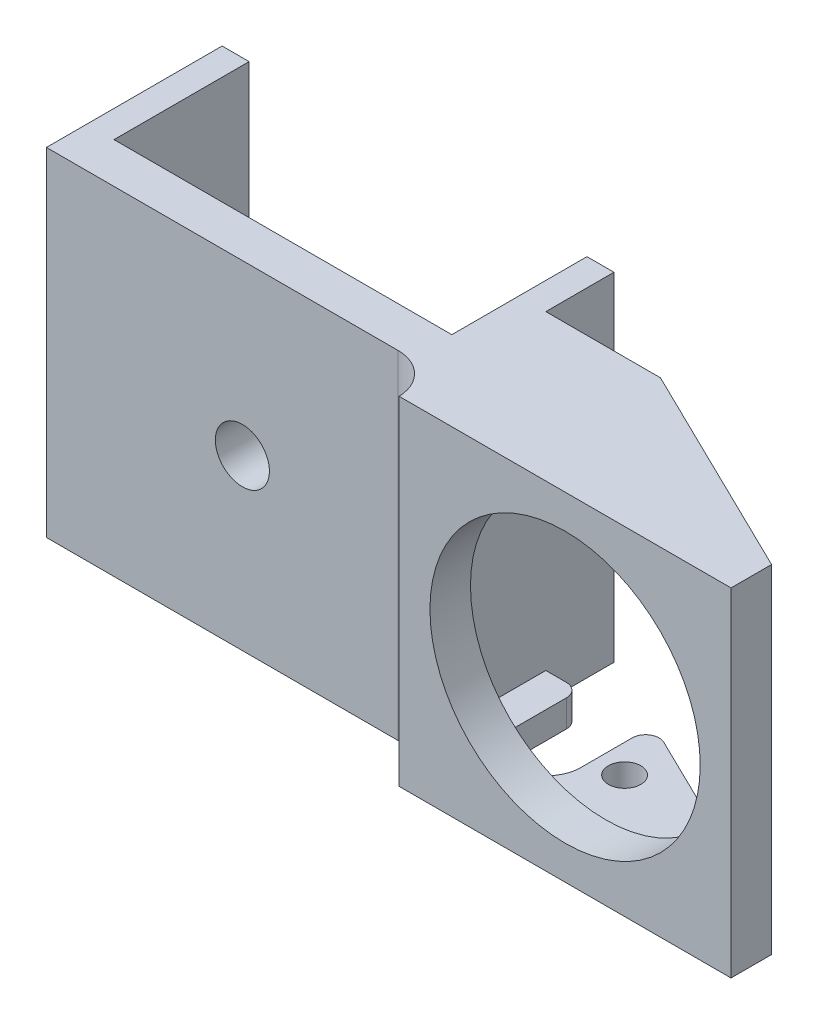
ISO-10303-21;
HEADER;
FILE_DESCRIPTION(('STEP AP214'),'2;1');
FILE_NAME('part.step','',(''),(''),'','','');
FILE_SCHEMA(('AUTOMOTIVE_DESIGN { 1 0 10303 214 1 1 1 1 }'));
ENDSEC;
DATA;
#1=APPLICATION_CONTEXT('core data for automotive mechanical design processes');
#2=APPLICATION_PROTOCOL_DEFINITION('international standard','automotive_design',2000,#1);
#3=PRODUCT_CONTEXT('',#1,'mechanical');
#4=PRODUCT('Part','Part','',(#3));
#5=PRODUCT_RELATED_PRODUCT_CATEGORY('part','',(#4));
#6=PRODUCT_DEFINITION_FORMATION('','',#4);
#7=PRODUCT_DEFINITION_CONTEXT('part definition',#1,'design');
#8=PRODUCT_DEFINITION('design','',#6,#7);
#9=PRODUCT_DEFINITION_SHAPE('','',#8);
#10=(LENGTH_UNIT() NAMED_UNIT(*) SI_UNIT(.MILLI.,.METRE.));
#11=(NAMED_UNIT(*) PLANE_ANGLE_UNIT() SI_UNIT($,.RADIAN.));
#12=(NAMED_UNIT(*) SI_UNIT($,.STERADIAN.) SOLID_ANGLE_UNIT());
#13=UNCERTAINTY_MEASURE_WITH_UNIT(LENGTH_MEASURE(1.E-05),#10,'distance_accuracy_value','');
#14=(GEOMETRIC_REPRESENTATION_CONTEXT(3) GLOBAL_UNCERTAINTY_ASSIGNED_CONTEXT((#13)) GLOBAL_UNIT_ASSIGNED_CONTEXT((#10,
#11,#12)) REPRESENTATION_CONTEXT('',''));
#15=CARTESIAN_POINT('',(0.,0.,0.));
#16=DIRECTION('',(0.,0.,1.));
#17=DIRECTION('',(1.,0.,0.));
#18=AXIS2_PLACEMENT_3D('',#15,#16,#17);
#19=CARTESIAN_POINT('',(0.,0.,0.));
#20=DIRECTION('',(0.,0.,1.));
#21=DIRECTION('',(1.,0.,0.));
#22=AXIS2_PLACEMENT_3D('',#19,#20,#21);
#23=PLANE('',#22);
#24=CARTESIAN_POINT('',(0.,0.,0.));
#25=DIRECTION('',(0.,0.,1.));
#26=DIRECTION('',(1.,0.,0.));
#27=AXIS2_PLACEMENT_3D('',#24,#25,#26);
#28=CIRCLE('',#27,10.);
#29=CARTESIAN_POINT('',(10.,0.,0.));
#30=VERTEX_POINT('',#29);
#31=EDGE_CURVE('E332',#30,#30,#28,.T.);
#32=ORIENTED_EDGE('',*,*,#31,.T.);
#33=EDGE_LOOP('',(#32));
#34=FACE_BOUND('',#33,.T.);
#35=DIRECTION('',(1.,0.,0.));
#36=VECTOR('',#35,1.);
#37=CARTESIAN_POINT('',(0.,-10.5,0.));
#38=LINE('',#37,#36);
#39=CARTESIAN_POINT('',(-12.280701754386,-10.5,0.));
#40=VERTEX_POINT('',#39);
#41=CARTESIAN_POINT('',(12.280701754386,-10.5,0.));
#42=VERTEX_POINT('',#41);
#43=EDGE_CURVE('E222',#40,#42,#38,.T.);
#44=ORIENTED_EDGE('',*,*,#43,.F.);
#45=DIRECTION('',(0.,-1.,0.));
#46=VECTOR('',#45,1.);
#47=CARTESIAN_POINT('',(-12.280701754386,12.5,0.));
#48=LINE('',#47,#46);
#49=CARTESIAN_POINT('',(-12.280701754386,10.5,0.));
#50=VERTEX_POINT('',#49);
#51=EDGE_CURVE('E348',#50,#40,#48,.T.);
#52=ORIENTED_EDGE('',*,*,#51,.F.);
#53=DIRECTION('',(-1.,0.,0.));
#54=VECTOR('',#53,1.);
#55=CARTESIAN_POINT('',(0.,10.5,0.));
#56=LINE('',#55,#54);
#57=CARTESIAN_POINT('',(12.280701754386,10.5,0.));
#58=VERTEX_POINT('',#57);
#59=EDGE_CURVE('E275',#58,#50,#56,.T.);
#60=ORIENTED_EDGE('',*,*,#59,.F.);
#61=DIRECTION('',(0.,1.,0.));
#62=VECTOR('',#61,1.);
#63=CARTESIAN_POINT('',(12.280701754386,12.5,0.));
#64=LINE('',#63,#62);
#65=EDGE_CURVE('E342',#42,#58,#64,.T.);
#66=ORIENTED_EDGE('',*,*,#65,.F.);
#67=EDGE_LOOP('',(#44,#52,#60,#66));
#68=FACE_BOUND('',#67,.T.);
#69=ADVANCED_FACE('F35',(#34,#68),#23,.F.);
#70=CARTESIAN_POINT('',(-12.280701754386,12.5,-2.9));
#71=DIRECTION('',(1.,0.,0.));
#72=DIRECTION('',(0.,0.,-1.));
#73=AXIS2_PLACEMENT_3D('',#70,#71,#72);
#74=PLANE('',#73);
#75=DIRECTION('',(0.,0.,1.));
#76=VECTOR('',#75,1.);
#77=CARTESIAN_POINT('',(-12.280701754386,-10.5,0.));
#78=LINE('',#77,#76);
#79=CARTESIAN_POINT('',(-12.280701754386,-10.5,-7.85510152890928));
#80=VERTEX_POINT('',#79);
#81=EDGE_CURVE('E194',#80,#40,#78,.T.);
#82=ORIENTED_EDGE('',*,*,#81,.F.);
#83=DIRECTION('',(0.,-1.,0.));
#84=VECTOR('',#83,1.);
#85=CARTESIAN_POINT('',(-12.280701754386,-10.5,-7.85510152890928));
#86=LINE('',#85,#84);
#87=CARTESIAN_POINT('',(-12.280701754386,-12.5,-7.85510152890928));
#88=VERTEX_POINT('',#87);
#89=EDGE_CURVE('E200',#80,#88,#86,.T.);
#90=ORIENTED_EDGE('',*,*,#89,.T.);
#91=DIRECTION('',(0.,0.,1.));
#92=VECTOR('',#91,1.);
#93=CARTESIAN_POINT('',(-12.280701754386,-12.5,-2.9));
#94=LINE('',#93,#92);
#95=CARTESIAN_POINT('',(-12.280701754386,-12.5,-12.9));
#96=VERTEX_POINT('',#95);
#97=EDGE_CURVE('E329',#96,#88,#94,.T.);
#98=ORIENTED_EDGE('',*,*,#97,.F.);
#99=DIRECTION('',(0.,-1.,0.));
#100=VECTOR('',#99,1.);
#101=CARTESIAN_POINT('',(-12.280701754386,12.5,-12.9));
#102=LINE('',#101,#100);
#103=CARTESIAN_POINT('',(-12.280701754386,12.5,-12.9));
#104=VERTEX_POINT('',#103);
#105=EDGE_CURVE('E299',#104,#96,#102,.T.);
#106=ORIENTED_EDGE('',*,*,#105,.F.);
#107=DIRECTION('',(0.,0.,1.));
#108=VECTOR('',#107,1.);
#109=CARTESIAN_POINT('',(-12.280701754386,12.5,-2.9));
#110=LINE('',#109,#108);
#111=CARTESIAN_POINT('',(-12.280701754386,12.5,-7.85510152890928));
#112=VERTEX_POINT('',#111);
#113=EDGE_CURVE('E323',#104,#112,#110,.T.);
#114=ORIENTED_EDGE('',*,*,#113,.T.);
#115=DIRECTION('',(0.,1.,0.));
#116=VECTOR('',#115,1.);
#117=CARTESIAN_POINT('',(-12.280701754386,12.5,-7.85510152890928));
#118=LINE('',#117,#116);
#119=CARTESIAN_POINT('',(-12.280701754386,10.5,-7.85510152890928));
#120=VERTEX_POINT('',#119);
#121=EDGE_CURVE('E278',#120,#112,#118,.T.);
#122=ORIENTED_EDGE('',*,*,#121,.F.);
#123=DIRECTION('',(0.,0.,1.));
#124=VECTOR('',#123,1.);
#125=CARTESIAN_POINT('',(-12.280701754386,10.5,-2.9));
#126=LINE('',#125,#124);
#127=EDGE_CURVE('E272',#120,#50,#126,.T.);
#128=ORIENTED_EDGE('',*,*,#127,.T.);
#129=ORIENTED_EDGE('',*,*,#51,.T.);
#130=EDGE_LOOP('',(#82,#90,#98,#106,#114,#122,#128,#129));
#131=FACE_BOUND('',#130,.T.);
#132=ADVANCED_FACE('F414',(#131),#74,.T.);
#133=CARTESIAN_POINT('',(0.,0.,-2.9));
#134=DIRECTION('',(0.,0.,1.));
#135=DIRECTION('',(1.,0.,0.));
#136=AXIS2_PLACEMENT_3D('',#133,#134,#135);
#137=PLANE('',#136);
#138=CARTESIAN_POINT('',(-26.780701754386,0.,-2.9));
#139=DIRECTION('',(0.,0.,-1.));
#140=DIRECTION('',(-1.,0.,0.));
#141=AXIS2_PLACEMENT_3D('',#138,#139,#140);
#142=CIRCLE('',#141,2.);
#143=CARTESIAN_POINT('',(-28.780701754386,0.,-2.9));
#144=VERTEX_POINT('',#143);
#145=EDGE_CURVE('E369',#144,#144,#142,.T.);
#146=ORIENTED_EDGE('',*,*,#145,.F.);
#147=EDGE_LOOP('',(#146));
#148=FACE_BOUND('',#147,.T.);
#149=DIRECTION('',(0.,-1.,0.));
#150=VECTOR('',#149,1.);
#151=CARTESIAN_POINT('',(-39.280701754386,12.5,-2.9));
#152=LINE('',#151,#150);
#153=CARTESIAN_POINT('',(-39.280701754386,12.5,-2.9));
#154=VERTEX_POINT('',#153);
#155=CARTESIAN_POINT('',(-39.280701754386,-12.5,-2.9));
#156=VERTEX_POINT('',#155);
#157=EDGE_CURVE('E281',#154,#156,#152,.T.);
#158=ORIENTED_EDGE('',*,*,#157,.F.);
#159=DIRECTION('',(-1.,0.,0.));
#160=VECTOR('',#159,1.);
#161=CARTESIAN_POINT('',(-12.280701754386,12.5,-2.9));
#162=LINE('',#161,#160);
#163=CARTESIAN_POINT('',(-14.280701754386,12.5,-2.9));
#164=VERTEX_POINT('',#163);
#165=EDGE_CURVE('E317',#164,#154,#162,.T.);
#166=ORIENTED_EDGE('',*,*,#165,.F.);
#167=DIRECTION('',(0.,1.,0.));
#168=VECTOR('',#167,1.);
#169=CARTESIAN_POINT('',(-14.280701754386,12.5,-2.9));
#170=LINE('',#169,#168);
#171=CARTESIAN_POINT('',(-14.280701754386,-12.5,-2.9));
#172=VERTEX_POINT('',#171);
#173=EDGE_CURVE('E298',#172,#164,#170,.T.);
#174=ORIENTED_EDGE('',*,*,#173,.F.);
#175=DIRECTION('',(1.,0.,0.));
#176=VECTOR('',#175,1.);
#177=CARTESIAN_POINT('',(-41.280701754386,-12.5,-2.9));
#178=LINE('',#177,#176);
#179=EDGE_CURVE('E320',#156,#172,#178,.T.);
#180=ORIENTED_EDGE('',*,*,#179,.F.);
#181=EDGE_LOOP('',(#158,#166,#174,#180));
#182=FACE_BOUND('',#181,.T.);
#183=ADVANCED_FACE('F403',(#148,#182),#137,.F.);
#184=CARTESIAN_POINT('',(0.,0.,3.));
#185=DIRECTION('',(0.,0.,1.));
#186=DIRECTION('',(1.,0.,0.));
#187=AXIS2_PLACEMENT_3D('',#184,#185,#186);
#188=PLANE('',#187);
#189=DIRECTION('',(0.,-1.,0.));
#190=VECTOR('',#189,1.);
#191=CARTESIAN_POINT('',(-12.280701754386,12.5,3.));
#192=LINE('',#191,#190);
#193=CARTESIAN_POINT('',(-12.280701754386,12.5,3.));
#194=VERTEX_POINT('',#193);
#195=CARTESIAN_POINT('',(-12.280701754386,-12.5,3.));
#196=VERTEX_POINT('',#195);
#197=EDGE_CURVE('E351',#194,#196,#192,.T.);
#198=ORIENTED_EDGE('',*,*,#197,.T.);
#199=DIRECTION('',(1.,0.,0.));
#200=VECTOR('',#199,1.);
#201=CARTESIAN_POINT('',(-12.280701754386,-12.5,3.));
#202=LINE('',#201,#200);
#203=CARTESIAN_POINT('',(12.280701754386,-12.5,3.));
#204=VERTEX_POINT('',#203);
#205=EDGE_CURVE('E353',#196,#204,#202,.T.);
#206=ORIENTED_EDGE('',*,*,#205,.T.);
#207=DIRECTION('',(0.,1.,0.));
#208=VECTOR('',#207,1.);
#209=CARTESIAN_POINT('',(12.280701754386,12.5,3.));
#210=LINE('',#209,#208);
#211=CARTESIAN_POINT('',(12.280701754386,12.5,3.));
#212=VERTEX_POINT('',#211);
#213=EDGE_CURVE('E345',#204,#212,#210,.T.);
#214=ORIENTED_EDGE('',*,*,#213,.T.);
#215=DIRECTION('',(-1.,0.,0.));
#216=VECTOR('',#215,1.);
#217=CARTESIAN_POINT('',(-12.280701754386,12.5,3.));
#218=LINE('',#217,#216);
#219=EDGE_CURVE('E347',#212,#194,#218,.T.);
#220=ORIENTED_EDGE('',*,*,#219,.T.);
#221=EDGE_LOOP('',(#198,#206,#214,#220));
#222=FACE_BOUND('',#221,.T.);
#223=CARTESIAN_POINT('',(0.,0.,3.));
#224=DIRECTION('',(0.,0.,1.));
#225=DIRECTION('',(1.,0.,0.));
#226=AXIS2_PLACEMENT_3D('',#223,#224,#225);
#227=CIRCLE('',#226,10.);
#228=CARTESIAN_POINT('',(10.,0.,3.));
#229=VERTEX_POINT('',#228);
#230=EDGE_CURVE('E339',#229,#229,#227,.T.);
#231=ORIENTED_EDGE('',*,*,#230,.F.);
#232=EDGE_LOOP('',(#231));
#233=FACE_BOUND('',#232,.T.);
#234=ADVANCED_FACE('F376',(#222,#233),#188,.T.);
#235=CARTESIAN_POINT('',(12.280701754386,12.5,3.));
#236=DIRECTION('',(-1.,0.,0.));
#237=DIRECTION('',(0.,0.,1.));
#238=AXIS2_PLACEMENT_3D('',#235,#236,#237);
#239=PLANE('',#238);
#240=DIRECTION('',(0.,0.,-1.));
#241=VECTOR('',#240,1.);
#242=CARTESIAN_POINT('',(12.280701754386,12.5,3.));
#243=LINE('',#242,#241);
#244=CARTESIAN_POINT('',(12.280701754386,12.5,0.));
#245=VERTEX_POINT('',#244);
#246=EDGE_CURVE('E363',#212,#245,#243,.T.);
#247=ORIENTED_EDGE('',*,*,#246,.F.);
#248=ORIENTED_EDGE('',*,*,#213,.F.);
#249=DIRECTION('',(0.,0.,-1.));
#250=VECTOR('',#249,1.);
#251=CARTESIAN_POINT('',(12.280701754386,-12.5,3.));
#252=LINE('',#251,#250);
#253=CARTESIAN_POINT('',(12.280701754386,-12.5,0.));
#254=VERTEX_POINT('',#253);
#255=EDGE_CURVE('E355',#204,#254,#252,.T.);
#256=ORIENTED_EDGE('',*,*,#255,.T.);
#257=EDGE_CURVE('E356',#254,#42,#64,.T.);
#258=ORIENTED_EDGE('',*,*,#257,.T.);
#259=ORIENTED_EDGE('',*,*,#65,.T.);
#260=DIRECTION('',(0.,1.,0.));
#261=VECTOR('',#260,1.);
#262=CARTESIAN_POINT('',(12.280701754386,10.5,0.));
#263=LINE('',#262,#261);
#264=EDGE_CURVE('E265',#58,#245,#263,.T.);
#265=ORIENTED_EDGE('',*,*,#264,.T.);
#266=EDGE_LOOP('',(#247,#248,#256,#258,#259,#265));
#267=FACE_BOUND('',#266,.T.);
#268=ADVANCED_FACE('F423',(#267),#239,.F.);
#269=CARTESIAN_POINT('',(-12.280701754386,12.5,3.));
#270=DIRECTION('',(0.,-1.,0.));
#271=DIRECTION('',(0.,0.,-1.));
#272=AXIS2_PLACEMENT_3D('',#269,#270,#271);
#273=PLANE('',#272);
#274=DIRECTION('',(0.,0.,1.));
#275=VECTOR('',#274,1.);
#276=CARTESIAN_POINT('',(-41.280701754386,12.5,-2.9));
#277=LINE('',#276,#275);
#278=CARTESIAN_POINT('',(-41.280701754386,12.5,-12.9));
#279=VERTEX_POINT('',#278);
#280=CARTESIAN_POINT('',(-41.280701754386,12.5,0.1));
#281=VERTEX_POINT('',#280);
#282=EDGE_CURVE('E335',#279,#281,#277,.T.);
#283=ORIENTED_EDGE('',*,*,#282,.T.);
#284=DIRECTION('',(-1.,0.,0.));
#285=VECTOR('',#284,1.);
#286=CARTESIAN_POINT('',(-12.280701754386,12.5,0.1));
#287=LINE('',#286,#285);
#288=CARTESIAN_POINT('',(-15.279034624499,12.5,0.1));
#289=VERTEX_POINT('',#288);
#290=EDGE_CURVE('E316',#289,#281,#287,.T.);
#291=ORIENTED_EDGE('',*,*,#290,.F.);
#292=CARTESIAN_POINT('',(-15.279034624499,12.5,3.1));
#293=DIRECTION('',(0.,-1.,0.));
#294=DIRECTION('',(0.,0.,-1.));
#295=AXIS2_PLACEMENT_3D('',#292,#293,#294);
#296=CIRCLE('',#295,3.);
#297=EDGE_CURVE('E43',#289,#194,#296,.T.);
#298=ORIENTED_EDGE('',*,*,#297,.T.);
#299=ORIENTED_EDGE('',*,*,#219,.F.);
#300=ORIENTED_EDGE('',*,*,#246,.T.);
#301=DIRECTION('',(-0.898496880140947,0.,-0.438979904297434));
#302=VECTOR('',#301,1.);
#303=CARTESIAN_POINT('',(12.280701754386,12.5,0.));
#304=LINE('',#303,#302);
#305=CARTESIAN_POINT('',(-3.79699143344004,12.5,-7.85510152890928));
#306=VERTEX_POINT('',#305);
#307=EDGE_CURVE('E262',#245,#306,#304,.T.);
#308=ORIENTED_EDGE('',*,*,#307,.T.);
#309=DIRECTION('',(-1.,0.,0.));
#310=VECTOR('',#309,1.);
#311=CARTESIAN_POINT('',(-3.79699143344004,12.5,-7.85510152890928));
#312=LINE('',#311,#310);
#313=EDGE_CURVE('E246',#306,#112,#312,.T.);
#314=ORIENTED_EDGE('',*,*,#313,.T.);
#315=ORIENTED_EDGE('',*,*,#113,.F.);
#316=DIRECTION('',(1.,0.,0.));
#317=VECTOR('',#316,1.);
#318=CARTESIAN_POINT('',(-12.280701754386,12.5,-12.9));
#319=LINE('',#318,#317);
#320=CARTESIAN_POINT('',(-14.280701754386,12.5,-12.9));
#321=VERTEX_POINT('',#320);
#322=EDGE_CURVE('E306',#321,#104,#319,.T.);
#323=ORIENTED_EDGE('',*,*,#322,.F.);
#324=DIRECTION('',(0.,0.,1.));
#325=VECTOR('',#324,1.);
#326=CARTESIAN_POINT('',(-14.280701754386,12.5,-12.9));
#327=LINE('',#326,#325);
#328=EDGE_CURVE('E309',#321,#164,#327,.T.);
#329=ORIENTED_EDGE('',*,*,#328,.T.);
#330=ORIENTED_EDGE('',*,*,#165,.T.);
#331=DIRECTION('',(0.,0.,1.));
#332=VECTOR('',#331,1.);
#333=CARTESIAN_POINT('',(-39.280701754386,12.5,-12.9));
#334=LINE('',#333,#332);
#335=CARTESIAN_POINT('',(-39.280701754386,12.5,-12.9));
#336=VERTEX_POINT('',#335);
#337=EDGE_CURVE('E296',#336,#154,#334,.T.);
#338=ORIENTED_EDGE('',*,*,#337,.F.);
#339=DIRECTION('',(1.,0.,0.));
#340=VECTOR('',#339,1.);
#341=CARTESIAN_POINT('',(-41.280701754386,12.5,-12.9));
#342=LINE('',#341,#340);
#343=EDGE_CURVE('E285',#279,#336,#342,.T.);
#344=ORIENTED_EDGE('',*,*,#343,.F.);
#345=EDGE_LOOP('',(#283,#291,#298,#299,#300,#308,#314,#315,#323,#329,#330,#338,#344));
#346=FACE_BOUND('',#345,.T.);
#347=ADVANCED_FACE('F373',(#346),#273,.F.);
#348=CARTESIAN_POINT('',(-12.280701754386,-12.5,3.));
#349=DIRECTION('',(0.,1.,0.));
#350=DIRECTION('',(0.,0.,1.));
#351=AXIS2_PLACEMENT_3D('',#348,#349,#350);
#352=PLANE('',#351);
#353=DIRECTION('',(-0.898496880140947,0.,-0.438979904297434));
#354=VECTOR('',#353,1.);
#355=CARTESIAN_POINT('',(2.3665324467349,-12.5,-4.84377986173809));
#356=LINE('',#355,#354);
#357=CARTESIAN_POINT('',(-3.32633107512898,-12.5,-7.6251503252773));
#358=VERTEX_POINT('',#357);
#359=EDGE_CURVE('E243',#254,#358,#356,.T.);
#360=ORIENTED_EDGE('',*,*,#359,.F.);
#361=ORIENTED_EDGE('',*,*,#255,.F.);
#362=ORIENTED_EDGE('',*,*,#205,.F.);
#363=CARTESIAN_POINT('',(-15.279034624499,-12.5,3.1));
#364=DIRECTION('',(0.,1.,0.));
#365=DIRECTION('',(0.,0.,1.));
#366=AXIS2_PLACEMENT_3D('',#363,#364,#365);
#367=CIRCLE('',#366,3.);
#368=CARTESIAN_POINT('',(-15.279034624499,-12.5,0.1));
#369=VERTEX_POINT('',#368);
#370=EDGE_CURVE('E11',#196,#369,#367,.T.);
#371=ORIENTED_EDGE('',*,*,#370,.T.);
#372=DIRECTION('',(1.,0.,0.));
#373=VECTOR('',#372,1.);
#374=CARTESIAN_POINT('',(-41.280701754386,-12.5,0.1));
#375=LINE('',#374,#373);
#376=CARTESIAN_POINT('',(-41.280701754386,-12.5,0.1));
#377=VERTEX_POINT('',#376);
#378=EDGE_CURVE('E321',#377,#369,#375,.T.);
#379=ORIENTED_EDGE('',*,*,#378,.F.);
#380=DIRECTION('',(0.,0.,1.));
#381=VECTOR('',#380,1.);
#382=CARTESIAN_POINT('',(-41.280701754386,-12.5,-2.9));
#383=LINE('',#382,#381);
#384=CARTESIAN_POINT('',(-41.280701754386,-12.5,-12.9));
#385=VERTEX_POINT('',#384);
#386=EDGE_CURVE('E333',#385,#377,#383,.T.);
#387=ORIENTED_EDGE('',*,*,#386,.F.);
#388=DIRECTION('',(-1.,0.,0.));
#389=VECTOR('',#388,1.);
#390=CARTESIAN_POINT('',(-41.280701754386,-12.5,-12.9));
#391=LINE('',#390,#389);
#392=CARTESIAN_POINT('',(-39.280701754386,-12.5,-12.9));
#393=VERTEX_POINT('',#392);
#394=EDGE_CURVE('E289',#393,#385,#391,.T.);
#395=ORIENTED_EDGE('',*,*,#394,.F.);
#396=DIRECTION('',(0.,0.,1.));
#397=VECTOR('',#396,1.);
#398=CARTESIAN_POINT('',(-39.280701754386,-12.5,-12.9));
#399=LINE('',#398,#397);
#400=EDGE_CURVE('E292',#393,#156,#399,.T.);
#401=ORIENTED_EDGE('',*,*,#400,.T.);
#402=ORIENTED_EDGE('',*,*,#179,.T.);
#403=DIRECTION('',(0.,0.,1.));
#404=VECTOR('',#403,1.);
#405=CARTESIAN_POINT('',(-14.280701754386,-12.5,-12.9));
#406=LINE('',#405,#404);
#407=CARTESIAN_POINT('',(-14.280701754386,-12.5,-12.9));
#408=VERTEX_POINT('',#407);
#409=EDGE_CURVE('E313',#408,#172,#406,.T.);
#410=ORIENTED_EDGE('',*,*,#409,.F.);
#411=DIRECTION('',(-1.,0.,0.));
#412=VECTOR('',#411,1.);
#413=CARTESIAN_POINT('',(-12.280701754386,-12.5,-12.9));
#414=LINE('',#413,#412);
#415=EDGE_CURVE('E302',#96,#408,#414,.T.);
#416=ORIENTED_EDGE('',*,*,#415,.F.);
#417=ORIENTED_EDGE('',*,*,#97,.T.);
#418=DIRECTION('',(-1.,0.,0.));
#419=VECTOR('',#418,1.);
#420=CARTESIAN_POINT('',(0.,-12.5,-7.85510152890928));
#421=LINE('',#420,#419);
#422=CARTESIAN_POINT('',(-10.7653109794264,-12.5,-7.85510152890928));
#423=VERTEX_POINT('',#422);
#424=EDGE_CURVE('E228',#423,#88,#421,.T.);
#425=ORIENTED_EDGE('',*,*,#424,.F.);
#426=CARTESIAN_POINT('',(-10.7653109794264,-12.5,-6.85510152890928));
#427=DIRECTION('',(0.,-1.,0.));
#428=DIRECTION('',(0.,0.,-1.));
#429=AXIS2_PLACEMENT_3D('',#426,#427,#428);
#430=CIRCLE('',#429,1.);
#431=CARTESIAN_POINT('',(-9.76531097942642,-12.5,-6.85510152890927));
#432=VERTEX_POINT('',#431);
#433=EDGE_CURVE('E190',#423,#432,#430,.T.);
#434=ORIENTED_EDGE('',*,*,#433,.T.);
#435=DIRECTION('',(0.,0.,-1.));
#436=VECTOR('',#435,1.);
#437=CARTESIAN_POINT('',(-9.76531097942642,-12.5,0.));
#438=LINE('',#437,#436);
#439=CARTESIAN_POINT('',(-9.76531097942642,-12.5,-2.91633111884913));
#440=VERTEX_POINT('',#439);
#441=EDGE_CURVE('E232',#440,#432,#438,.T.);
#442=ORIENTED_EDGE('',*,*,#441,.F.);
#443=CARTESIAN_POINT('',(-7.26531097942641,-12.5,-2.91633111884913));
#444=DIRECTION('',(0.,-1.,0.));
#445=DIRECTION('',(0.,0.,-1.));
#446=AXIS2_PLACEMENT_3D('',#443,#444,#445);
#447=CIRCLE('',#446,2.5);
#448=CARTESIAN_POINT('',(-4.76531097942641,-12.5,-2.91633111884913));
#449=VERTEX_POINT('',#448);
#450=EDGE_CURVE('E235',#449,#440,#447,.T.);
#451=ORIENTED_EDGE('',*,*,#450,.F.);
#452=DIRECTION('',(0.,0.,-1.));
#453=VECTOR('',#452,1.);
#454=CARTESIAN_POINT('',(-4.76531097942641,-12.5,0.));
#455=LINE('',#454,#453);
#456=CARTESIAN_POINT('',(-4.76531097942641,-12.5,-6.72665344513635));
#457=VERTEX_POINT('',#456);
#458=EDGE_CURVE('E237',#449,#457,#455,.T.);
#459=ORIENTED_EDGE('',*,*,#458,.T.);
#460=CARTESIAN_POINT('',(-3.76531097942641,-12.5,-6.72665344513635));
#461=DIRECTION('',(0.,-1.,0.));
#462=DIRECTION('',(0.,0.,-1.));
#463=AXIS2_PLACEMENT_3D('',#460,#461,#462);
#464=CIRCLE('',#463,1.);
#465=EDGE_CURVE('E240',#358,#457,#464,.F.);
#466=ORIENTED_EDGE('',*,*,#465,.F.);
#467=EDGE_LOOP('',(#360,#361,#362,#371,#379,#387,#395,#401,#402,#410,#416,#417,#425,#434,#442,
#451,#459,#466));
#468=FACE_BOUND('',#467,.T.);
#469=CARTESIAN_POINT('',(-2.6633111884922,-12.5,-4.06695040933499));
#470=DIRECTION('',(0.,-1.,0.));
#471=DIRECTION('',(0.,0.,-1.));
#472=AXIS2_PLACEMENT_3D('',#469,#470,#471);
#473=CIRCLE('',#472,1.2);
#474=CARTESIAN_POINT('',(-2.6633111884922,-12.5,-5.26695040933499));
#475=VERTEX_POINT('',#474);
#476=EDGE_CURVE('E225',#475,#475,#473,.T.);
#477=ORIENTED_EDGE('',*,*,#476,.F.);
#478=EDGE_LOOP('',(#477));
#479=FACE_BOUND('',#478,.T.);
#480=ADVANCED_FACE('F383',(#468,#479),#352,.F.);
#481=CARTESIAN_POINT('',(0.,0.,3.));
#482=DIRECTION('',(0.,0.,-1.));
#483=DIRECTION('',(-1.,0.,0.));
#484=AXIS2_PLACEMENT_3D('',#481,#482,#483);
#485=CYLINDRICAL_SURFACE('',#484,10.);
#486=ORIENTED_EDGE('',*,*,#230,.T.);
#487=EDGE_LOOP('',(#486));
#488=FACE_BOUND('',#487,.T.);
#489=ORIENTED_EDGE('',*,*,#31,.F.);
#490=EDGE_LOOP('',(#489));
#491=FACE_BOUND('',#490,.T.);
#492=ADVANCED_FACE('F468',(#488,#491),#485,.F.);
#493=CARTESIAN_POINT('',(-41.280701754386,12.5,-2.9));
#494=DIRECTION('',(-1.,0.,0.));
#495=DIRECTION('',(0.,0.,1.));
#496=AXIS2_PLACEMENT_3D('',#493,#494,#495);
#497=PLANE('',#496);
#498=DIRECTION('',(0.,-1.,0.));
#499=VECTOR('',#498,1.);
#500=CARTESIAN_POINT('',(-41.280701754386,12.5,0.1));
#501=LINE('',#500,#499);
#502=EDGE_CURVE('E325',#281,#377,#501,.T.);
#503=ORIENTED_EDGE('',*,*,#502,.F.);
#504=ORIENTED_EDGE('',*,*,#282,.F.);
#505=DIRECTION('',(0.,1.,0.));
#506=VECTOR('',#505,1.);
#507=CARTESIAN_POINT('',(-41.280701754386,12.5,-12.9));
#508=LINE('',#507,#506);
#509=EDGE_CURVE('E282',#385,#279,#508,.T.);
#510=ORIENTED_EDGE('',*,*,#509,.F.);
#511=ORIENTED_EDGE('',*,*,#386,.T.);
#512=EDGE_LOOP('',(#503,#504,#510,#511));
#513=FACE_BOUND('',#512,.T.);
#514=ADVANCED_FACE('F392',(#513),#497,.T.);
#515=CARTESIAN_POINT('',(0.,0.,0.1));
#516=DIRECTION('',(0.,0.,1.));
#517=DIRECTION('',(1.,0.,0.));
#518=AXIS2_PLACEMENT_3D('',#515,#516,#517);
#519=PLANE('',#518);
#520=CARTESIAN_POINT('',(-26.780701754386,0.,0.1));
#521=DIRECTION('',(0.,0.,1.));
#522=DIRECTION('',(1.,0.,0.));
#523=AXIS2_PLACEMENT_3D('',#520,#521,#522);
#524=CIRCLE('',#523,2.);
#525=CARTESIAN_POINT('',(-24.780701754386,0.,0.1));
#526=VERTEX_POINT('',#525);
#527=EDGE_CURVE('E229',#526,#526,#524,.T.);
#528=ORIENTED_EDGE('',*,*,#527,.F.);
#529=EDGE_LOOP('',(#528));
#530=FACE_BOUND('',#529,.T.);
#531=ORIENTED_EDGE('',*,*,#378,.T.);
#532=DIRECTION('',(0.,1.,0.));
#533=VECTOR('',#532,1.);
#534=CARTESIAN_POINT('',(-15.279034624499,12.5,0.1));
#535=LINE('',#534,#533);
#536=EDGE_CURVE('E366',#369,#289,#535,.T.);
#537=ORIENTED_EDGE('',*,*,#536,.T.);
#538=ORIENTED_EDGE('',*,*,#290,.T.);
#539=ORIENTED_EDGE('',*,*,#502,.T.);
#540=EDGE_LOOP('',(#531,#537,#538,#539));
#541=FACE_BOUND('',#540,.T.);
#542=ADVANCED_FACE('F380',(#530,#541),#519,.T.);
#543=CARTESIAN_POINT('',(-14.280701754386,12.5,-12.9));
#544=DIRECTION('',(1.,0.,0.));
#545=DIRECTION('',(0.,1.,0.));
#546=AXIS2_PLACEMENT_3D('',#543,#544,#545);
#547=PLANE('',#546);
#548=ORIENTED_EDGE('',*,*,#173,.T.);
#549=ORIENTED_EDGE('',*,*,#328,.F.);
#550=DIRECTION('',(0.,1.,0.));
#551=VECTOR('',#550,1.);
#552=CARTESIAN_POINT('',(-14.280701754386,12.5,-12.9));
#553=LINE('',#552,#551);
#554=EDGE_CURVE('E304',#408,#321,#553,.T.);
#555=ORIENTED_EDGE('',*,*,#554,.F.);
#556=ORIENTED_EDGE('',*,*,#409,.T.);
#557=EDGE_LOOP('',(#548,#549,#555,#556));
#558=FACE_BOUND('',#557,.T.);
#559=ADVANCED_FACE('F407',(#558),#547,.F.);
#560=CARTESIAN_POINT('',(0.,0.,-12.9));
#561=DIRECTION('',(0.,0.,-1.));
#562=DIRECTION('',(-1.,0.,0.));
#563=AXIS2_PLACEMENT_3D('',#560,#561,#562);
#564=PLANE('',#563);
#565=ORIENTED_EDGE('',*,*,#105,.T.);
#566=ORIENTED_EDGE('',*,*,#415,.T.);
#567=ORIENTED_EDGE('',*,*,#554,.T.);
#568=ORIENTED_EDGE('',*,*,#322,.T.);
#569=EDGE_LOOP('',(#565,#566,#567,#568));
#570=FACE_BOUND('',#569,.T.);
#571=ADVANCED_FACE('F411',(#570),#564,.T.);
#572=CARTESIAN_POINT('',(-39.280701754386,12.5,-12.9));
#573=DIRECTION('',(-1.,0.,0.));
#574=DIRECTION('',(0.,0.,1.));
#575=AXIS2_PLACEMENT_3D('',#572,#573,#574);
#576=PLANE('',#575);
#577=ORIENTED_EDGE('',*,*,#157,.T.);
#578=ORIENTED_EDGE('',*,*,#400,.F.);
#579=DIRECTION('',(0.,-1.,0.));
#580=VECTOR('',#579,1.);
#581=CARTESIAN_POINT('',(-39.280701754386,12.5,-12.9));
#582=LINE('',#581,#580);
#583=EDGE_CURVE('E287',#336,#393,#582,.T.);
#584=ORIENTED_EDGE('',*,*,#583,.F.);
#585=ORIENTED_EDGE('',*,*,#337,.T.);
#586=EDGE_LOOP('',(#577,#578,#584,#585));
#587=FACE_BOUND('',#586,.T.);
#588=ADVANCED_FACE('F398',(#587),#576,.F.);
#589=CARTESIAN_POINT('',(0.,0.,-12.9));
#590=DIRECTION('',(0.,0.,1.));
#591=DIRECTION('',(1.,0.,0.));
#592=AXIS2_PLACEMENT_3D('',#589,#590,#591);
#593=PLANE('',#592);
#594=ORIENTED_EDGE('',*,*,#509,.T.);
#595=ORIENTED_EDGE('',*,*,#343,.T.);
#596=ORIENTED_EDGE('',*,*,#583,.T.);
#597=ORIENTED_EDGE('',*,*,#394,.T.);
#598=EDGE_LOOP('',(#594,#595,#596,#597));
#599=FACE_BOUND('',#598,.T.);
#600=ADVANCED_FACE('F389',(#599),#593,.F.);
#601=CARTESIAN_POINT('',(0.,10.5,0.));
#602=DIRECTION('',(0.,1.,0.));
#603=DIRECTION('',(0.,0.,1.));
#604=AXIS2_PLACEMENT_3D('',#601,#602,#603);
#605=PLANE('',#604);
#606=DIRECTION('',(-0.898496880140947,0.,-0.438979904297434));
#607=VECTOR('',#606,1.);
#608=CARTESIAN_POINT('',(12.280701754386,10.5,0.));
#609=LINE('',#608,#607);
#610=CARTESIAN_POINT('',(-3.79699143344004,10.5,-7.85510152890928));
#611=VERTEX_POINT('',#610);
#612=EDGE_CURVE('E261',#58,#611,#609,.T.);
#613=ORIENTED_EDGE('',*,*,#612,.F.);
#614=ORIENTED_EDGE('',*,*,#59,.T.);
#615=ORIENTED_EDGE('',*,*,#127,.F.);
#616=DIRECTION('',(-1.,0.,0.));
#617=VECTOR('',#616,1.);
#618=CARTESIAN_POINT('',(-3.79699143344004,10.5,-7.85510152890928));
#619=LINE('',#618,#617);
#620=EDGE_CURVE('E258',#611,#120,#619,.T.);
#621=ORIENTED_EDGE('',*,*,#620,.F.);
#622=EDGE_LOOP('',(#613,#614,#615,#621));
#623=FACE_BOUND('',#622,.T.);
#624=ADVANCED_FACE('F530',(#623),#605,.F.);
#625=CARTESIAN_POINT('',(-3.79699143344004,10.5,-7.85510152890928));
#626=DIRECTION('',(0.,0.,-1.));
#627=DIRECTION('',(-1.,0.,0.));
#628=AXIS2_PLACEMENT_3D('',#625,#626,#627);
#629=PLANE('',#628);
#630=ORIENTED_EDGE('',*,*,#620,.T.);
#631=ORIENTED_EDGE('',*,*,#121,.T.);
#632=ORIENTED_EDGE('',*,*,#313,.F.);
#633=DIRECTION('',(0.,1.,0.));
#634=VECTOR('',#633,1.);
#635=CARTESIAN_POINT('',(-3.79699143344004,10.5,-7.85510152890928));
#636=LINE('',#635,#634);
#637=EDGE_CURVE('E270',#611,#306,#636,.T.);
#638=ORIENTED_EDGE('',*,*,#637,.F.);
#639=EDGE_LOOP('',(#630,#631,#632,#638));
#640=FACE_BOUND('',#639,.T.);
#641=ADVANCED_FACE('F536',(#640),#629,.T.);
#642=CARTESIAN_POINT('',(12.280701754386,10.5,0.));
#643=DIRECTION('',(0.438979904297434,0.,-0.898496880140947));
#644=DIRECTION('',(-0.898496880140947,0.,-0.438979904297434));
#645=AXIS2_PLACEMENT_3D('',#642,#643,#644);
#646=PLANE('',#645);
#647=ORIENTED_EDGE('',*,*,#307,.F.);
#648=ORIENTED_EDGE('',*,*,#264,.F.);
#649=ORIENTED_EDGE('',*,*,#612,.T.);
#650=ORIENTED_EDGE('',*,*,#637,.T.);
#651=EDGE_LOOP('',(#647,#648,#649,#650));
#652=FACE_BOUND('',#651,.T.);
#653=ADVANCED_FACE('F544',(#652),#646,.T.);
#654=CARTESIAN_POINT('',(0.,-10.5,-7.85510152890928));
#655=DIRECTION('',(0.,0.,1.));
#656=DIRECTION('',(1.,0.,0.));
#657=AXIS2_PLACEMENT_3D('',#654,#655,#656);
#658=PLANE('',#657);
#659=ORIENTED_EDGE('',*,*,#424,.T.);
#660=ORIENTED_EDGE('',*,*,#89,.F.);
#661=DIRECTION('',(-1.,0.,0.));
#662=VECTOR('',#661,1.);
#663=CARTESIAN_POINT('',(0.,-10.5,-7.85510152890928));
#664=LINE('',#663,#662);
#665=CARTESIAN_POINT('',(-10.7653109794264,-10.5,-7.85510152890928));
#666=VERTEX_POINT('',#665);
#667=EDGE_CURVE('E197',#666,#80,#664,.T.);
#668=ORIENTED_EDGE('',*,*,#667,.F.);
#669=DIRECTION('',(0.,-1.,0.));
#670=VECTOR('',#669,1.);
#671=CARTESIAN_POINT('',(-10.7653109794264,-10.5,-7.85510152890928));
#672=LINE('',#671,#670);
#673=EDGE_CURVE('E184',#666,#423,#672,.T.);
#674=ORIENTED_EDGE('',*,*,#673,.T.);
#675=EDGE_LOOP('',(#659,#660,#668,#674));
#676=FACE_BOUND('',#675,.T.);
#677=ADVANCED_FACE('F198',(#676),#658,.F.);
#678=CARTESIAN_POINT('',(2.3665324467349,-10.5,-4.84377986173809));
#679=DIRECTION('',(-0.438979904297434,0.,0.898496880140947));
#680=DIRECTION('',(0.898496880140947,0.,0.438979904297434));
#681=AXIS2_PLACEMENT_3D('',#678,#679,#680);
#682=PLANE('',#681);
#683=ORIENTED_EDGE('',*,*,#359,.T.);
#684=DIRECTION('',(0.,-1.,0.));
#685=VECTOR('',#684,1.);
#686=CARTESIAN_POINT('',(-3.32633107512898,-10.5,-7.6251503252773));
#687=LINE('',#686,#685);
#688=CARTESIAN_POINT('',(-3.32633107512898,-10.5,-7.6251503252773));
#689=VERTEX_POINT('',#688);
#690=EDGE_CURVE('E247',#689,#358,#687,.T.);
#691=ORIENTED_EDGE('',*,*,#690,.F.);
#692=DIRECTION('',(-0.898496880140947,0.,-0.438979904297434));
#693=VECTOR('',#692,1.);
#694=CARTESIAN_POINT('',(2.3665324467349,-10.5,-4.84377986173809));
#695=LINE('',#694,#693);
#696=EDGE_CURVE('E220',#42,#689,#695,.T.);
#697=ORIENTED_EDGE('',*,*,#696,.F.);
#698=ORIENTED_EDGE('',*,*,#257,.F.);
#699=EDGE_LOOP('',(#683,#691,#697,#698));
#700=FACE_BOUND('',#699,.T.);
#701=ADVANCED_FACE('F426',(#700),#682,.F.);
#702=CARTESIAN_POINT('',(-3.76531097942641,-10.5,-6.72665344513635));
#703=DIRECTION('',(0.,-1.,0.));
#704=DIRECTION('',(0.,0.,-1.));
#705=AXIS2_PLACEMENT_3D('',#702,#703,#704);
#706=CYLINDRICAL_SURFACE('',#705,1.);
#707=ORIENTED_EDGE('',*,*,#465,.T.);
#708=DIRECTION('',(0.,-1.,0.));
#709=VECTOR('',#708,1.);
#710=CARTESIAN_POINT('',(-4.76531097942641,-10.5,-6.72665344513635));
#711=LINE('',#710,#709);
#712=CARTESIAN_POINT('',(-4.76531097942641,-10.5,-6.72665344513635));
#713=VERTEX_POINT('',#712);
#714=EDGE_CURVE('E250',#713,#457,#711,.T.);
#715=ORIENTED_EDGE('',*,*,#714,.F.);
#716=CARTESIAN_POINT('',(-3.76531097942641,-10.5,-6.72665344513635));
#717=DIRECTION('',(0.,-1.,0.));
#718=DIRECTION('',(0.,0.,-1.));
#719=AXIS2_PLACEMENT_3D('',#716,#717,#718);
#720=CIRCLE('',#719,1.);
#721=EDGE_CURVE('E218',#689,#713,#720,.F.);
#722=ORIENTED_EDGE('',*,*,#721,.F.);
#723=ORIENTED_EDGE('',*,*,#690,.T.);
#724=EDGE_LOOP('',(#707,#715,#722,#723));
#725=FACE_BOUND('',#724,.T.);
#726=ADVANCED_FACE('F433',(#725),#706,.T.);
#727=CARTESIAN_POINT('',(-4.76531097942641,-10.5,0.));
#728=DIRECTION('',(-1.,0.,0.));
#729=DIRECTION('',(0.,0.,1.));
#730=AXIS2_PLACEMENT_3D('',#727,#728,#729);
#731=PLANE('',#730);
#732=ORIENTED_EDGE('',*,*,#458,.F.);
#733=DIRECTION('',(0.,-1.,0.));
#734=VECTOR('',#733,1.);
#735=CARTESIAN_POINT('',(-4.76531097942641,-10.5,-2.91633111884913));
#736=LINE('',#735,#734);
#737=CARTESIAN_POINT('',(-4.76531097942641,-10.5,-2.91633111884913));
#738=VERTEX_POINT('',#737);
#739=EDGE_CURVE('E252',#738,#449,#736,.T.);
#740=ORIENTED_EDGE('',*,*,#739,.F.);
#741=DIRECTION('',(0.,0.,-1.));
#742=VECTOR('',#741,1.);
#743=CARTESIAN_POINT('',(-4.76531097942641,-10.5,0.));
#744=LINE('',#743,#742);
#745=EDGE_CURVE('E215',#738,#713,#744,.T.);
#746=ORIENTED_EDGE('',*,*,#745,.T.);
#747=ORIENTED_EDGE('',*,*,#714,.T.);
#748=EDGE_LOOP('',(#732,#740,#746,#747));
#749=FACE_BOUND('',#748,.T.);
#750=ADVANCED_FACE('F439',(#749),#731,.T.);
#751=CARTESIAN_POINT('',(-7.26531097942641,-10.5,-2.91633111884913));
#752=DIRECTION('',(0.,-1.,0.));
#753=DIRECTION('',(0.,0.,-1.));
#754=AXIS2_PLACEMENT_3D('',#751,#752,#753);
#755=CYLINDRICAL_SURFACE('',#754,2.5);
#756=ORIENTED_EDGE('',*,*,#450,.T.);
#757=DIRECTION('',(0.,-1.,0.));
#758=VECTOR('',#757,1.);
#759=CARTESIAN_POINT('',(-9.76531097942642,-10.5,-2.91633111884913));
#760=LINE('',#759,#758);
#761=CARTESIAN_POINT('',(-9.76531097942642,-10.5,-2.91633111884913));
#762=VERTEX_POINT('',#761);
#763=EDGE_CURVE('E254',#762,#440,#760,.T.);
#764=ORIENTED_EDGE('',*,*,#763,.F.);
#765=CARTESIAN_POINT('',(-7.26531097942641,-10.5,-2.91633111884913));
#766=DIRECTION('',(0.,-1.,0.));
#767=DIRECTION('',(0.,0.,-1.));
#768=AXIS2_PLACEMENT_3D('',#765,#766,#767);
#769=CIRCLE('',#768,2.5);
#770=EDGE_CURVE('E210',#738,#762,#769,.T.);
#771=ORIENTED_EDGE('',*,*,#770,.F.);
#772=ORIENTED_EDGE('',*,*,#739,.T.);
#773=EDGE_LOOP('',(#756,#764,#771,#772));
#774=FACE_BOUND('',#773,.T.);
#775=ADVANCED_FACE('F441',(#774),#755,.F.);
#776=CARTESIAN_POINT('',(-9.76531097942642,-10.5,0.));
#777=DIRECTION('',(-1.,0.,0.));
#778=DIRECTION('',(0.,0.,1.));
#779=AXIS2_PLACEMENT_3D('',#776,#777,#778);
#780=PLANE('',#779);
#781=ORIENTED_EDGE('',*,*,#441,.T.);
#782=DIRECTION('',(0.,-1.,0.));
#783=VECTOR('',#782,1.);
#784=CARTESIAN_POINT('',(-9.76531097942642,-10.5,-6.85510152890927));
#785=LINE('',#784,#783);
#786=CARTESIAN_POINT('',(-9.76531097942642,-10.5,-6.85510152890927));
#787=VERTEX_POINT('',#786);
#788=EDGE_CURVE('E193',#787,#432,#785,.T.);
#789=ORIENTED_EDGE('',*,*,#788,.F.);
#790=DIRECTION('',(0.,0.,-1.));
#791=VECTOR('',#790,1.);
#792=CARTESIAN_POINT('',(-9.76531097942642,-10.5,0.));
#793=LINE('',#792,#791);
#794=EDGE_CURVE('E207',#762,#787,#793,.T.);
#795=ORIENTED_EDGE('',*,*,#794,.F.);
#796=ORIENTED_EDGE('',*,*,#763,.T.);
#797=EDGE_LOOP('',(#781,#789,#795,#796));
#798=FACE_BOUND('',#797,.T.);
#799=ADVANCED_FACE('F444',(#798),#780,.F.);
#800=CARTESIAN_POINT('',(-2.6633111884922,-10.5,-4.06695040933499));
#801=DIRECTION('',(0.,-1.,0.));
#802=DIRECTION('',(0.,0.,-1.));
#803=AXIS2_PLACEMENT_3D('',#800,#801,#802);
#804=CYLINDRICAL_SURFACE('',#803,1.2);
#805=CARTESIAN_POINT('',(-2.6633111884922,-10.5,-4.06695040933499));
#806=DIRECTION('',(0.,-1.,0.));
#807=DIRECTION('',(0.,0.,-1.));
#808=AXIS2_PLACEMENT_3D('',#805,#806,#807);
#809=CIRCLE('',#808,1.2);
#810=CARTESIAN_POINT('',(-2.6633111884922,-10.5,-5.26695040933499));
#811=VERTEX_POINT('',#810);
#812=EDGE_CURVE('E203',#811,#811,#809,.T.);
#813=ORIENTED_EDGE('',*,*,#812,.F.);
#814=EDGE_LOOP('',(#813));
#815=FACE_BOUND('',#814,.T.);
#816=ORIENTED_EDGE('',*,*,#476,.T.);
#817=EDGE_LOOP('',(#816));
#818=FACE_BOUND('',#817,.T.);
#819=ADVANCED_FACE('F446',(#815,#818),#804,.F.);
#820=CARTESIAN_POINT('',(-10.7653109794264,-10.5,-6.85510152890928));
#821=DIRECTION('',(0.,-1.,0.));
#822=DIRECTION('',(0.,0.,-1.));
#823=AXIS2_PLACEMENT_3D('',#820,#821,#822);
#824=CYLINDRICAL_SURFACE('',#823,1.);
#825=ORIENTED_EDGE('',*,*,#433,.F.);
#826=ORIENTED_EDGE('',*,*,#673,.F.);
#827=CARTESIAN_POINT('',(-10.7653109794264,-10.5,-6.85510152890928));
#828=DIRECTION('',(0.,-1.,0.));
#829=DIRECTION('',(0.,0.,-1.));
#830=AXIS2_PLACEMENT_3D('',#827,#828,#829);
#831=CIRCLE('',#830,1.);
#832=EDGE_CURVE('E188',#666,#787,#831,.T.);
#833=ORIENTED_EDGE('',*,*,#832,.T.);
#834=ORIENTED_EDGE('',*,*,#788,.T.);
#835=EDGE_LOOP('',(#825,#826,#833,#834));
#836=FACE_BOUND('',#835,.T.);
#837=ADVANCED_FACE('F186',(#836),#824,.T.);
#838=CARTESIAN_POINT('',(0.,-10.5,0.));
#839=DIRECTION('',(0.,-1.,0.));
#840=DIRECTION('',(0.,0.,-1.));
#841=AXIS2_PLACEMENT_3D('',#838,#839,#840);
#842=PLANE('',#841);
#843=ORIENTED_EDGE('',*,*,#812,.T.);
#844=EDGE_LOOP('',(#843));
#845=FACE_BOUND('',#844,.T.);
#846=ORIENTED_EDGE('',*,*,#667,.T.);
#847=ORIENTED_EDGE('',*,*,#81,.T.);
#848=ORIENTED_EDGE('',*,*,#43,.T.);
#849=ORIENTED_EDGE('',*,*,#696,.T.);
#850=ORIENTED_EDGE('',*,*,#721,.T.);
#851=ORIENTED_EDGE('',*,*,#745,.F.);
#852=ORIENTED_EDGE('',*,*,#770,.T.);
#853=ORIENTED_EDGE('',*,*,#794,.T.);
#854=ORIENTED_EDGE('',*,*,#832,.F.);
#855=EDGE_LOOP('',(#846,#847,#848,#849,#850,#851,#852,#853,#854));
#856=FACE_BOUND('',#855,.T.);
#857=ADVANCED_FACE('F205',(#845,#856),#842,.F.);
#858=CARTESIAN_POINT('',(-26.780701754386,0.,3.));
#859=DIRECTION('',(0.,0.,-1.));
#860=DIRECTION('',(-1.,0.,0.));
#861=AXIS2_PLACEMENT_3D('',#858,#859,#860);
#862=CYLINDRICAL_SURFACE('',#861,2.);
#863=ORIENTED_EDGE('',*,*,#527,.T.);
#864=EDGE_LOOP('',(#863));
#865=FACE_BOUND('',#864,.T.);
#866=ORIENTED_EDGE('',*,*,#145,.T.);
#867=EDGE_LOOP('',(#866));
#868=FACE_BOUND('',#867,.T.);
#869=ADVANCED_FACE('F606',(#865,#868),#862,.F.);
#870=CARTESIAN_POINT('',(-15.279034624499,12.5,3.1));
#871=DIRECTION('',(0.,-1.,0.));
#872=DIRECTION('',(0.,0.,-1.));
#873=AXIS2_PLACEMENT_3D('',#870,#871,#872);
#874=CYLINDRICAL_SURFACE('',#873,3.);
#875=ORIENTED_EDGE('',*,*,#370,.F.);
#876=ORIENTED_EDGE('',*,*,#197,.F.);
#877=ORIENTED_EDGE('',*,*,#297,.F.);
#878=ORIENTED_EDGE('',*,*,#536,.F.);
#879=EDGE_LOOP('',(#875,#876,#877,#878));
#880=FACE_BOUND('',#879,.T.);
#881=ADVANCED_FACE('F37',(#880),#874,.F.);
#882=CLOSED_SHELL('',(#69,#132,#183,#234,#268,#347,#480,#492,#514,#542,#559,#571,#588,#600,#624,
#641,#653,#677,#701,#726,#750,#775,#799,#819,#837,#857,#869,#881));
#883=MANIFOLD_SOLID_BREP('B2',#882);
#884=ADVANCED_BREP_SHAPE_REPRESENTATION('',(#18,#883),#14);
#885=SHAPE_DEFINITION_REPRESENTATION(#9,#884);
ENDSEC;
END-ISO-10303-21;
